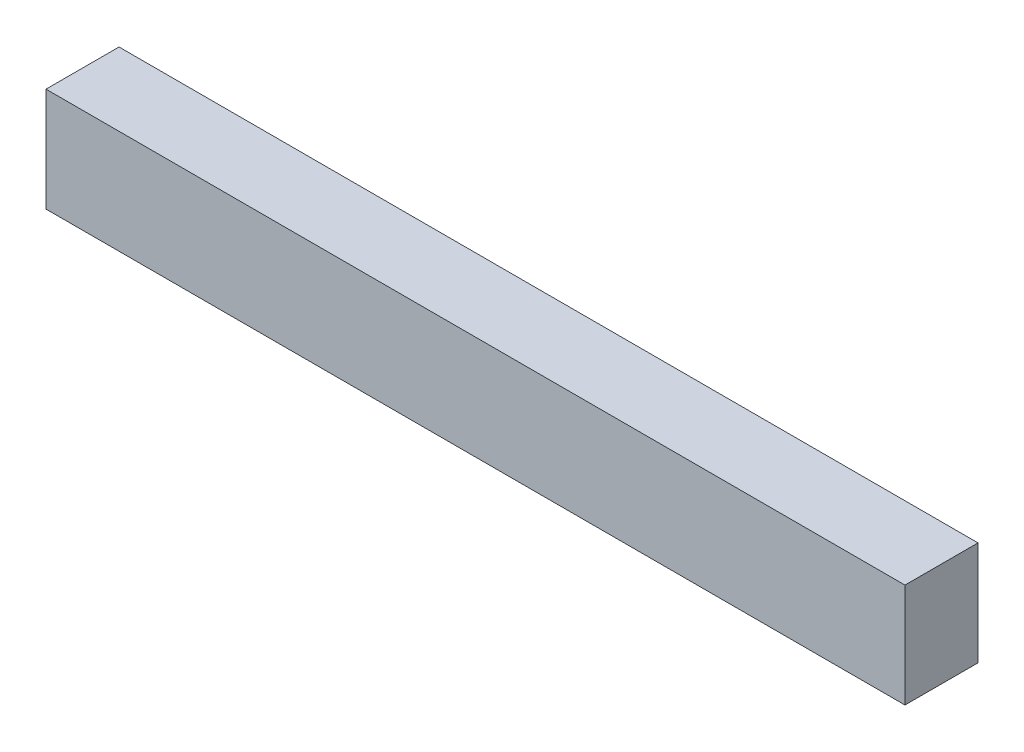
ISO-10303-21;
HEADER;
FILE_DESCRIPTION(('STEP AP214'),'2;1');
FILE_NAME('part.step','',(''),(''),'','','');
FILE_SCHEMA(('AUTOMOTIVE_DESIGN { 1 0 10303 214 1 1 1 1 }'));
ENDSEC;
DATA;
#1=APPLICATION_CONTEXT('core data for automotive mechanical design processes');
#2=APPLICATION_PROTOCOL_DEFINITION('international standard','automotive_design',2000,#1);
#3=PRODUCT_CONTEXT('',#1,'mechanical');
#4=PRODUCT('Part','Part','',(#3));
#5=PRODUCT_RELATED_PRODUCT_CATEGORY('part','',(#4));
#6=PRODUCT_DEFINITION_FORMATION('','',#4);
#7=PRODUCT_DEFINITION_CONTEXT('part definition',#1,'design');
#8=PRODUCT_DEFINITION('design','',#6,#7);
#9=PRODUCT_DEFINITION_SHAPE('','',#8);
#10=(LENGTH_UNIT() NAMED_UNIT(*) SI_UNIT(.MILLI.,.METRE.));
#11=(NAMED_UNIT(*) PLANE_ANGLE_UNIT() SI_UNIT($,.RADIAN.));
#12=(NAMED_UNIT(*) SI_UNIT($,.STERADIAN.) SOLID_ANGLE_UNIT());
#13=UNCERTAINTY_MEASURE_WITH_UNIT(LENGTH_MEASURE(1.E-05),#10,'distance_accuracy_value','');
#14=(GEOMETRIC_REPRESENTATION_CONTEXT(3) GLOBAL_UNCERTAINTY_ASSIGNED_CONTEXT((#13)) GLOBAL_UNIT_ASSIGNED_CONTEXT((#10,
#11,#12)) REPRESENTATION_CONTEXT('',''));
#15=CARTESIAN_POINT('',(0.,0.,0.));
#16=DIRECTION('',(0.,0.,1.));
#17=DIRECTION('',(1.,0.,0.));
#18=AXIS2_PLACEMENT_3D('',#15,#16,#17);
#19=CARTESIAN_POINT('',(-6.4262,-0.7112,1.));
#20=DIRECTION('',(1.,0.,0.));
#21=DIRECTION('',(0.,0.,-1.));
#22=AXIS2_PLACEMENT_3D('',#19,#20,#21);
#23=PLANE('',#22);
#24=DIRECTION('',(0.,-1.,0.));
#25=VECTOR('',#24,1.);
#26=CARTESIAN_POINT('',(-6.4262,-0.7112,0.));
#27=LINE('',#26,#25);
#28=CARTESIAN_POINT('',(-6.4262,0.7112,0.));
#29=VERTEX_POINT('',#28);
#30=CARTESIAN_POINT('',(-6.4262,-0.7112,0.));
#31=VERTEX_POINT('',#30);
#32=EDGE_CURVE('E95',#29,#31,#27,.T.);
#33=ORIENTED_EDGE('',*,*,#32,.T.);
#34=DIRECTION('',(0.,0.,-1.));
#35=VECTOR('',#34,1.);
#36=CARTESIAN_POINT('',(-6.4262,-0.7112,1.));
#37=LINE('',#36,#35);
#38=CARTESIAN_POINT('',(-6.4262,-0.7112,1.));
#39=VERTEX_POINT('',#38);
#40=EDGE_CURVE('E11',#39,#31,#37,.T.);
#41=ORIENTED_EDGE('',*,*,#40,.F.);
#42=DIRECTION('',(0.,-1.,0.));
#43=VECTOR('',#42,1.);
#44=CARTESIAN_POINT('',(-6.4262,-0.7112,1.));
#45=LINE('',#44,#43);
#46=CARTESIAN_POINT('',(-6.4262,0.7112,1.));
#47=VERTEX_POINT('',#46);
#48=EDGE_CURVE('E83',#47,#39,#45,.T.);
#49=ORIENTED_EDGE('',*,*,#48,.F.);
#50=DIRECTION('',(0.,0.,-1.));
#51=VECTOR('',#50,1.);
#52=CARTESIAN_POINT('',(-6.4262,0.7112,1.));
#53=LINE('',#52,#51);
#54=EDGE_CURVE('E91',#47,#29,#53,.T.);
#55=ORIENTED_EDGE('',*,*,#54,.T.);
#56=EDGE_LOOP('',(#33,#41,#49,#55));
#57=FACE_BOUND('',#56,.T.);
#58=ADVANCED_FACE('F32',(#57),#23,.F.);
#59=CARTESIAN_POINT('',(5.334,-0.7112,1.));
#60=DIRECTION('',(0.,1.,0.));
#61=DIRECTION('',(0.,0.,1.));
#62=AXIS2_PLACEMENT_3D('',#59,#60,#61);
#63=PLANE('',#62);
#64=DIRECTION('',(1.,0.,0.));
#65=VECTOR('',#64,1.);
#66=CARTESIAN_POINT('',(5.334,-0.7112,0.));
#67=LINE('',#66,#65);
#68=CARTESIAN_POINT('',(5.334,-0.7112,0.));
#69=VERTEX_POINT('',#68);
#70=EDGE_CURVE('E87',#31,#69,#67,.T.);
#71=ORIENTED_EDGE('',*,*,#70,.T.);
#72=DIRECTION('',(0.,0.,-1.));
#73=VECTOR('',#72,1.);
#74=CARTESIAN_POINT('',(5.334,-0.7112,1.));
#75=LINE('',#74,#73);
#76=CARTESIAN_POINT('',(5.334,-0.7112,1.));
#77=VERTEX_POINT('',#76);
#78=EDGE_CURVE('E40',#77,#69,#75,.T.);
#79=ORIENTED_EDGE('',*,*,#78,.F.);
#80=DIRECTION('',(1.,0.,0.));
#81=VECTOR('',#80,1.);
#82=CARTESIAN_POINT('',(5.334,-0.7112,1.));
#83=LINE('',#82,#81);
#84=EDGE_CURVE('E78',#39,#77,#83,.T.);
#85=ORIENTED_EDGE('',*,*,#84,.F.);
#86=ORIENTED_EDGE('',*,*,#40,.T.);
#87=EDGE_LOOP('',(#71,#79,#85,#86));
#88=FACE_BOUND('',#87,.T.);
#89=ADVANCED_FACE('F86',(#88),#63,.F.);
#90=CARTESIAN_POINT('',(5.334,0.7112,1.));
#91=DIRECTION('',(-1.,0.,0.));
#92=DIRECTION('',(0.,0.,1.));
#93=AXIS2_PLACEMENT_3D('',#90,#91,#92);
#94=PLANE('',#93);
#95=DIRECTION('',(0.,1.,0.));
#96=VECTOR('',#95,1.);
#97=CARTESIAN_POINT('',(5.334,0.7112,0.));
#98=LINE('',#97,#96);
#99=CARTESIAN_POINT('',(5.334,0.7112,0.));
#100=VERTEX_POINT('',#99);
#101=EDGE_CURVE('E65',#69,#100,#98,.T.);
#102=ORIENTED_EDGE('',*,*,#101,.T.);
#103=DIRECTION('',(0.,0.,-1.));
#104=VECTOR('',#103,1.);
#105=CARTESIAN_POINT('',(5.334,0.7112,1.));
#106=LINE('',#105,#104);
#107=CARTESIAN_POINT('',(5.334,0.7112,1.));
#108=VERTEX_POINT('',#107);
#109=EDGE_CURVE('E88',#108,#100,#106,.T.);
#110=ORIENTED_EDGE('',*,*,#109,.F.);
#111=DIRECTION('',(0.,1.,0.));
#112=VECTOR('',#111,1.);
#113=CARTESIAN_POINT('',(5.334,0.7112,1.));
#114=LINE('',#113,#112);
#115=EDGE_CURVE('E81',#77,#108,#114,.T.);
#116=ORIENTED_EDGE('',*,*,#115,.F.);
#117=ORIENTED_EDGE('',*,*,#78,.T.);
#118=EDGE_LOOP('',(#102,#110,#116,#117));
#119=FACE_BOUND('',#118,.T.);
#120=ADVANCED_FACE('F89',(#119),#94,.F.);
#121=CARTESIAN_POINT('',(-6.4262,0.7112,1.));
#122=DIRECTION('',(0.,-1.,0.));
#123=DIRECTION('',(0.,0.,-1.));
#124=AXIS2_PLACEMENT_3D('',#121,#122,#123);
#125=PLANE('',#124);
#126=DIRECTION('',(-1.,0.,0.));
#127=VECTOR('',#126,1.);
#128=CARTESIAN_POINT('',(-6.4262,0.7112,0.));
#129=LINE('',#128,#127);
#130=EDGE_CURVE('E71',#100,#29,#129,.T.);
#131=ORIENTED_EDGE('',*,*,#130,.T.);
#132=ORIENTED_EDGE('',*,*,#54,.F.);
#133=DIRECTION('',(-1.,0.,0.));
#134=VECTOR('',#133,1.);
#135=CARTESIAN_POINT('',(-6.4262,0.7112,1.));
#136=LINE('',#135,#134);
#137=EDGE_CURVE('E48',#108,#47,#136,.T.);
#138=ORIENTED_EDGE('',*,*,#137,.F.);
#139=ORIENTED_EDGE('',*,*,#109,.T.);
#140=EDGE_LOOP('',(#131,#132,#138,#139));
#141=FACE_BOUND('',#140,.T.);
#142=ADVANCED_FACE('F102',(#141),#125,.F.);
#143=CARTESIAN_POINT('',(0.,0.,1.));
#144=DIRECTION('',(0.,0.,-1.));
#145=DIRECTION('',(-1.,0.,0.));
#146=AXIS2_PLACEMENT_3D('',#143,#144,#145);
#147=PLANE('',#146);
#148=ORIENTED_EDGE('',*,*,#48,.T.);
#149=ORIENTED_EDGE('',*,*,#84,.T.);
#150=ORIENTED_EDGE('',*,*,#115,.T.);
#151=ORIENTED_EDGE('',*,*,#137,.T.);
#152=EDGE_LOOP('',(#148,#149,#150,#151));
#153=FACE_BOUND('',#152,.T.);
#154=ADVANCED_FACE('F79',(#153),#147,.F.);
#155=CARTESIAN_POINT('',(0.,0.,0.));
#156=DIRECTION('',(0.,0.,-1.));
#157=DIRECTION('',(-1.,0.,0.));
#158=AXIS2_PLACEMENT_3D('',#155,#156,#157);
#159=PLANE('',#158);
#160=ORIENTED_EDGE('',*,*,#32,.F.);
#161=ORIENTED_EDGE('',*,*,#130,.F.);
#162=ORIENTED_EDGE('',*,*,#101,.F.);
#163=ORIENTED_EDGE('',*,*,#70,.F.);
#164=EDGE_LOOP('',(#160,#161,#162,#163));
#165=FACE_BOUND('',#164,.T.);
#166=ADVANCED_FACE('F105',(#165),#159,.T.);
#167=CLOSED_SHELL('',(#58,#89,#120,#142,#154,#166));
#168=MANIFOLD_SOLID_BREP('B2',#167);
#169=ADVANCED_BREP_SHAPE_REPRESENTATION('',(#18,#168),#14);
#170=SHAPE_DEFINITION_REPRESENTATION(#9,#169);
ENDSEC;
END-ISO-10303-21;
